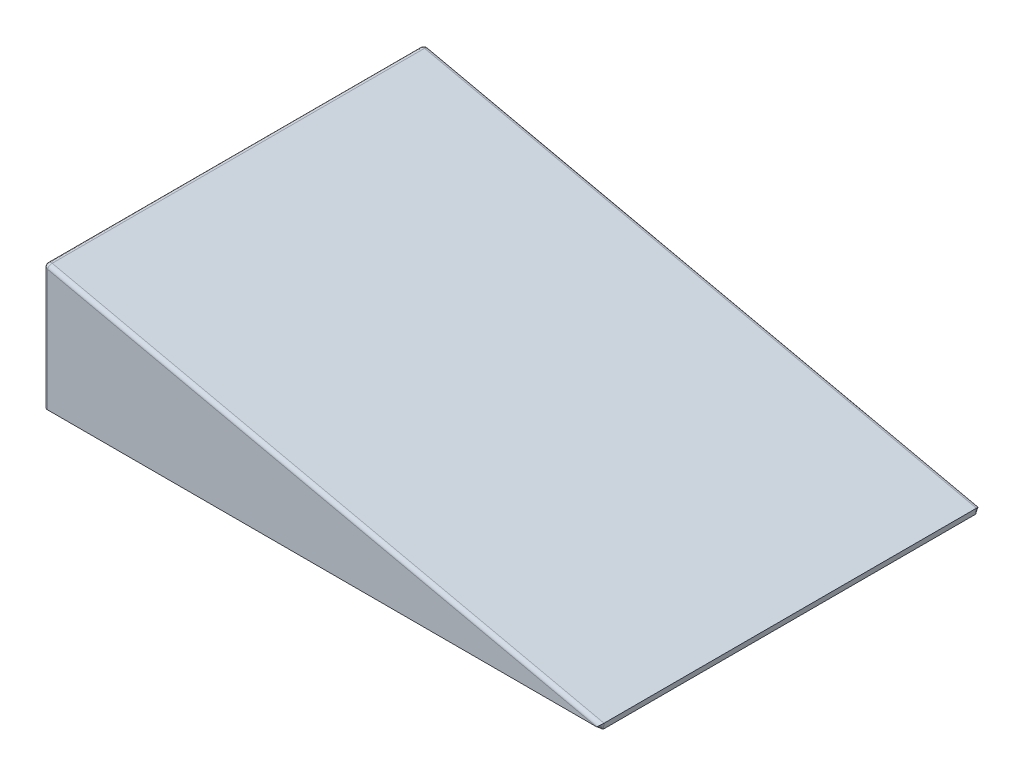
ISO-10303-21;
HEADER;
FILE_DESCRIPTION(('STEP AP214'),'2;1');
FILE_NAME('part.step','',(''),(''),'','','');
FILE_SCHEMA(('AUTOMOTIVE_DESIGN { 1 0 10303 214 1 1 1 1 }'));
ENDSEC;
DATA;
#1=APPLICATION_CONTEXT('core data for automotive mechanical design processes');
#2=APPLICATION_PROTOCOL_DEFINITION('international standard','automotive_design',2000,#1);
#3=PRODUCT_CONTEXT('',#1,'mechanical');
#4=PRODUCT('Part','Part','',(#3));
#5=PRODUCT_RELATED_PRODUCT_CATEGORY('part','',(#4));
#6=PRODUCT_DEFINITION_FORMATION('','',#4);
#7=PRODUCT_DEFINITION_CONTEXT('part definition',#1,'design');
#8=PRODUCT_DEFINITION('design','',#6,#7);
#9=PRODUCT_DEFINITION_SHAPE('','',#8);
#10=(LENGTH_UNIT() NAMED_UNIT(*) SI_UNIT(.MILLI.,.METRE.));
#11=(NAMED_UNIT(*) PLANE_ANGLE_UNIT() SI_UNIT($,.RADIAN.));
#12=(NAMED_UNIT(*) SI_UNIT($,.STERADIAN.) SOLID_ANGLE_UNIT());
#13=UNCERTAINTY_MEASURE_WITH_UNIT(LENGTH_MEASURE(1.E-05),#10,'distance_accuracy_value','');
#14=(GEOMETRIC_REPRESENTATION_CONTEXT(3) GLOBAL_UNCERTAINTY_ASSIGNED_CONTEXT((#13)) GLOBAL_UNIT_ASSIGNED_CONTEXT((#10,
#11,#12)) REPRESENTATION_CONTEXT('',''));
#15=CARTESIAN_POINT('',(0.,0.,0.));
#16=DIRECTION('',(0.,0.,1.));
#17=DIRECTION('',(1.,0.,0.));
#18=AXIS2_PLACEMENT_3D('',#15,#16,#17);
#19=CARTESIAN_POINT('',(0.,0.,500.));
#20=DIRECTION('',(-1.,0.,0.));
#21=DIRECTION('',(0.,0.,1.));
#22=AXIS2_PLACEMENT_3D('',#19,#20,#21);
#23=PLANE('',#22);
#24=DIRECTION('',(0.,1.,0.));
#25=VECTOR('',#24,1.);
#26=CARTESIAN_POINT('',(0.,0.,-490.));
#27=LINE('',#26,#25);
#28=CARTESIAN_POINT('',(0.,326.865758230426,-490.));
#29=VERTEX_POINT('',#28);
#30=CARTESIAN_POINT('',(0.,6.37070260807602,-490.));
#31=VERTEX_POINT('',#30);
#32=EDGE_CURVE('E149',#29,#31,#27,.F.);
#33=ORIENTED_EDGE('',*,*,#32,.T.);
#34=DIRECTION('',(0.,0.,1.));
#35=VECTOR('',#34,1.);
#36=CARTESIAN_POINT('',(0.,6.37070260807602,500.));
#37=LINE('',#36,#35);
#38=CARTESIAN_POINT('',(0.,6.37070260807602,490.));
#39=VERTEX_POINT('',#38);
#40=EDGE_CURVE('E489',#31,#39,#37,.T.);
#41=ORIENTED_EDGE('',*,*,#40,.T.);
#42=DIRECTION('',(0.,1.,0.));
#43=VECTOR('',#42,1.);
#44=CARTESIAN_POINT('',(0.,0.,490.));
#45=LINE('',#44,#43);
#46=CARTESIAN_POINT('',(0.,326.865758230426,490.));
#47=VERTEX_POINT('',#46);
#48=EDGE_CURVE('E186',#39,#47,#45,.T.);
#49=ORIENTED_EDGE('',*,*,#48,.T.);
#50=DIRECTION('',(0.,0.,-1.));
#51=VECTOR('',#50,1.);
#52=CARTESIAN_POINT('',(0.,326.865758230426,500.));
#53=LINE('',#52,#51);
#54=EDGE_CURVE('E141',#47,#29,#53,.T.);
#55=ORIENTED_EDGE('',*,*,#54,.T.);
#56=EDGE_LOOP('',(#33,#41,#49,#55));
#57=FACE_BOUND('',#56,.T.);
#58=ADVANCED_FACE('F45',(#57),#23,.T.);
#59=CARTESIAN_POINT('',(1530.59841835943,0.,500.));
#60=DIRECTION('',(0.,-1.,0.));
#61=DIRECTION('',(0.,0.,-1.));
#62=AXIS2_PLACEMENT_3D('',#59,#60,#61);
#63=PLANE('',#62);
#64=CARTESIAN_POINT('',(1463.12565350232,0.,-490.));
#65=CARTESIAN_POINT('',(1463.12565350228,0.,-490.105762412387));
#66=CARTESIAN_POINT('',(1463.07752777564,0.,-490.211519819488));
#67=CARTESIAN_POINT('',(1462.88686961966,0.,-490.418977898737));
#68=CARTESIAN_POINT('',(1462.74434188805,0.,-490.52067226064));
#69=CARTESIAN_POINT('',(1462.3703524546,0.,-490.716093502087));
#70=CARTESIAN_POINT('',(1462.13889998266,0.,-490.809815560233));
#71=CARTESIAN_POINT('',(1461.59595147585,0.,-490.985690032319));
#72=CARTESIAN_POINT('',(1461.284468852,0.,-491.067838102488));
#73=CARTESIAN_POINT('',(1460.59342647906,0.,-491.2174070469));
#74=CARTESIAN_POINT('',(1460.21388380538,0.,-491.284824225489));
#75=CARTESIAN_POINT('',(1459.40130393753,0.,-491.402339791223));
#76=CARTESIAN_POINT('',(1458.96828682569,0.,-491.452435274121));
#77=CARTESIAN_POINT('',(1458.06539645203,0.,-491.533381403733));
#78=CARTESIAN_POINT('',(1457.59554550647,0.,-491.564230049746));
#79=CARTESIAN_POINT('',(1456.63704219789,0.,-491.605496028784));
#80=CARTESIAN_POINT('',(1456.14841907014,0.,-491.615912341806));
#81=CARTESIAN_POINT('',(1455.65977277742,0.,-491.615912341806));
#82=B_SPLINE_CURVE_WITH_KNOTS('',3,(#64,#65,#66,#67,#68,#69,#70,#71,#72,#73,#74,#75,#76,#77,#78,
#79,#80,#81),.UNSPECIFIED.,.F.,.F.,(4,2,2,2,2,2,2,2,4),(1.5707963267949,1.76714586764426,
1.96349540849362,2.15984494934298,2.35619449019234,2.55254403104171,2.74889357189107,
2.94524311274043,3.14159265358979),.UNSPECIFIED.);
#83=CARTESIAN_POINT('',(1455.65977277742,0.,-491.615912341806));
#84=VERTEX_POINT('',#83);
#85=CARTESIAN_POINT('',(1463.12565350232,0.,-490.));
#86=VERTEX_POINT('',#85);
#87=EDGE_CURVE('E271',#84,#86,#82,.F.);
#88=ORIENTED_EDGE('',*,*,#87,.T.);
#89=DIRECTION('',(0.,0.,1.));
#90=VECTOR('',#89,1.);
#91=CARTESIAN_POINT('',(1463.12565350232,0.,500.));
#92=LINE('',#91,#90);
#93=CARTESIAN_POINT('',(1463.12565350232,0.,490.));
#94=VERTEX_POINT('',#93);
#95=EDGE_CURVE('E11',#86,#94,#92,.T.);
#96=ORIENTED_EDGE('',*,*,#95,.T.);
#97=CARTESIAN_POINT('',(1455.65977277742,0.,491.615912341806));
#98=CARTESIAN_POINT('',(1456.14841907014,0.,491.615912341806));
#99=CARTESIAN_POINT('',(1456.63704219789,0.,491.605496028784));
#100=CARTESIAN_POINT('',(1457.59554550647,0.,491.564230049746));
#101=CARTESIAN_POINT('',(1458.06539645203,0.,491.533381403733));
#102=CARTESIAN_POINT('',(1458.96828682569,0.,491.452435274121));
#103=CARTESIAN_POINT('',(1459.40130393753,0.,491.402339791223));
#104=CARTESIAN_POINT('',(1460.21388380538,0.,491.284824225489));
#105=CARTESIAN_POINT('',(1460.59342647906,0.,491.2174070469));
#106=CARTESIAN_POINT('',(1461.284468852,0.,491.067838102488));
#107=CARTESIAN_POINT('',(1461.59595147585,0.,490.985690032319));
#108=CARTESIAN_POINT('',(1462.13889998266,0.,490.809815560233));
#109=CARTESIAN_POINT('',(1462.3703524546,0.,490.716093502087));
#110=CARTESIAN_POINT('',(1462.74434188805,0.,490.52067226064));
#111=CARTESIAN_POINT('',(1462.88686961966,0.,490.418977898737));
#112=CARTESIAN_POINT('',(1463.07752777564,0.,490.211519819488));
#113=CARTESIAN_POINT('',(1463.12565350228,0.,490.105762412387));
#114=CARTESIAN_POINT('',(1463.12565350232,0.,490.));
#115=B_SPLINE_CURVE_WITH_KNOTS('',3,(#97,#98,#99,#100,#101,#102,#103,#104,#105,#106,#107,#108,
#109,#110,#111,#112,#113,#114),.UNSPECIFIED.,.F.,.F.,(4,2,2,2,2,2,2,2,4),(0.,0.196349540849362,
0.392699081698724,0.589048622548086,0.785398163397448,0.98174770424681,1.17809724509617,
1.37444678594553,1.5707963267949),.UNSPECIFIED.);
#116=CARTESIAN_POINT('',(1455.65977277742,0.,491.615912341806));
#117=VERTEX_POINT('',#116);
#118=EDGE_CURVE('E58',#94,#117,#115,.F.);
#119=ORIENTED_EDGE('',*,*,#118,.T.);
#120=DIRECTION('',(-1.,0.,0.));
#121=VECTOR('',#120,1.);
#122=CARTESIAN_POINT('',(1530.59841835943,0.,491.615912341806));
#123=LINE('',#122,#121);
#124=CARTESIAN_POINT('',(10.,0.,491.615912341806));
#125=VERTEX_POINT('',#124);
#126=EDGE_CURVE('E307',#117,#125,#123,.T.);
#127=ORIENTED_EDGE('',*,*,#126,.T.);
#128=CARTESIAN_POINT('',(10.,0.,490.));
#129=DIRECTION('',(0.,-1.,0.));
#130=DIRECTION('',(0.,0.,-1.));
#131=AXIS2_PLACEMENT_3D('',#128,#129,#130);
#132=CIRCLE('',#131,1.61591234180582);
#133=CARTESIAN_POINT('',(8.38408765819418,0.,490.));
#134=VERTEX_POINT('',#133);
#135=EDGE_CURVE('E315',#125,#134,#132,.T.);
#136=ORIENTED_EDGE('',*,*,#135,.T.);
#137=DIRECTION('',(0.,0.,-1.));
#138=VECTOR('',#137,1.);
#139=CARTESIAN_POINT('',(8.38408765819421,0.,500.));
#140=LINE('',#139,#138);
#141=CARTESIAN_POINT('',(8.38408765819418,0.,-490.));
#142=VERTEX_POINT('',#141);
#143=EDGE_CURVE('E501',#134,#142,#140,.T.);
#144=ORIENTED_EDGE('',*,*,#143,.T.);
#145=CARTESIAN_POINT('',(10.,0.,-490.));
#146=DIRECTION('',(0.,-1.,0.));
#147=DIRECTION('',(0.,0.,-1.));
#148=AXIS2_PLACEMENT_3D('',#145,#146,#147);
#149=CIRCLE('',#148,1.6159123418058);
#150=CARTESIAN_POINT('',(10.,0.,-491.615912341806));
#151=VERTEX_POINT('',#150);
#152=EDGE_CURVE('E499',#142,#151,#149,.T.);
#153=ORIENTED_EDGE('',*,*,#152,.T.);
#154=DIRECTION('',(1.,0.,0.));
#155=VECTOR('',#154,1.);
#156=CARTESIAN_POINT('',(1455.65977277742,0.,-491.615912341806));
#157=LINE('',#156,#155);
#158=EDGE_CURVE('E275',#151,#84,#157,.T.);
#159=ORIENTED_EDGE('',*,*,#158,.T.);
#160=EDGE_LOOP('',(#88,#96,#119,#127,#136,#144,#153,#159));
#161=FACE_BOUND('',#160,.T.);
#162=ADVANCED_FACE('F289',(#161),#63,.T.);
#163=CARTESIAN_POINT('',(0.,339.3255,500.));
#164=DIRECTION('',(0.216439613938096,0.976296007119935,0.));
#165=DIRECTION('',(-0.976296007119935,0.216439613938096,0.));
#166=AXIS2_PLACEMENT_3D('',#163,#164,#165);
#167=PLANE('',#166);
#168=DIRECTION('',(0.976296007119935,-0.216439613938096,0.));
#169=VECTOR('',#168,1.);
#170=CARTESIAN_POINT('',(0.,339.3255,490.));
#171=LINE('',#170,#169);
#172=CARTESIAN_POINT('',(12.164396139381,336.628718301625,490.));
#173=VERTEX_POINT('',#172);
#174=CARTESIAN_POINT('',(1464.94030219829,14.5560539121146,490.));
#175=VERTEX_POINT('',#174);
#176=EDGE_CURVE('E208',#173,#175,#171,.T.);
#177=ORIENTED_EDGE('',*,*,#176,.T.);
#178=DIRECTION('',(0.,0.,-1.));
#179=VECTOR('',#178,1.);
#180=CARTESIAN_POINT('',(1464.94030219829,14.5560539121146,500.));
#181=LINE('',#180,#179);
#182=CARTESIAN_POINT('',(1464.94030219829,14.5560539121145,-490.));
#183=VERTEX_POINT('',#182);
#184=EDGE_CURVE('E250',#175,#183,#181,.T.);
#185=ORIENTED_EDGE('',*,*,#184,.T.);
#186=DIRECTION('',(0.976296007119935,-0.216439613938096,0.));
#187=VECTOR('',#186,1.);
#188=CARTESIAN_POINT('',(0.,339.3255,-490.));
#189=LINE('',#188,#187);
#190=CARTESIAN_POINT('',(12.164396139381,336.628718301625,-490.));
#191=VERTEX_POINT('',#190);
#192=EDGE_CURVE('E180',#183,#191,#189,.F.);
#193=ORIENTED_EDGE('',*,*,#192,.T.);
#194=DIRECTION('',(0.,0.,-1.));
#195=VECTOR('',#194,1.);
#196=CARTESIAN_POINT('',(12.164396139381,336.628718301625,500.));
#197=LINE('',#196,#195);
#198=EDGE_CURVE('E212',#191,#173,#197,.F.);
#199=ORIENTED_EDGE('',*,*,#198,.T.);
#200=EDGE_LOOP('',(#177,#185,#193,#199));
#201=FACE_BOUND('',#200,.T.);
#202=ADVANCED_FACE('F248',(#201),#167,.T.);
#203=CARTESIAN_POINT('',(0.,0.,500.));
#204=DIRECTION('',(0.,0.,1.));
#205=DIRECTION('',(1.,0.,0.));
#206=AXIS2_PLACEMENT_3D('',#203,#204,#205);
#207=PLANE('',#206);
#208=DIRECTION('',(0.,1.,0.));
#209=VECTOR('',#208,1.);
#210=CARTESIAN_POINT('',(10.,0.,500.));
#211=LINE('',#210,#209);
#212=CARTESIAN_POINT('',(10.,326.865758230426,500.));
#213=VERTEX_POINT('',#212);
#214=CARTESIAN_POINT('',(10.,6.37070260807602,500.));
#215=VERTEX_POINT('',#214);
#216=EDGE_CURVE('E194',#213,#215,#211,.F.);
#217=ORIENTED_EDGE('',*,*,#216,.T.);
#218=DIRECTION('',(1.,0.,0.));
#219=VECTOR('',#218,1.);
#220=CARTESIAN_POINT('',(0.,6.37070260807602,500.));
#221=LINE('',#220,#219);
#222=CARTESIAN_POINT('',(1455.65977277742,6.37070260807582,500.));
#223=VERTEX_POINT('',#222);
#224=EDGE_CURVE('E202',#215,#223,#221,.T.);
#225=ORIENTED_EDGE('',*,*,#224,.T.);
#226=DIRECTION('',(0.976296007119935,-0.216439613938096,0.));
#227=VECTOR('',#226,1.);
#228=CARTESIAN_POINT('',(69.5381803477638,313.666461423854,500.));
#229=LINE('',#228,#227);
#230=EDGE_CURVE('E191',#223,#213,#229,.F.);
#231=ORIENTED_EDGE('',*,*,#230,.T.);
#232=EDGE_LOOP('',(#217,#225,#231));
#233=FACE_BOUND('',#232,.T.);
#234=ADVANCED_FACE('F510',(#233),#207,.T.);
#235=CARTESIAN_POINT('',(0.,0.,-500.));
#236=DIRECTION('',(0.,0.,1.));
#237=DIRECTION('',(1.,0.,0.));
#238=AXIS2_PLACEMENT_3D('',#235,#236,#237);
#239=PLANE('',#238);
#240=DIRECTION('',(0.976296007119935,-0.216439613938096,0.));
#241=VECTOR('',#240,1.);
#242=CARTESIAN_POINT('',(1528.43402222005,-9.76296007119931,-500.));
#243=LINE('',#242,#241);
#244=CARTESIAN_POINT('',(10.,326.865758230426,-500.));
#245=VERTEX_POINT('',#244);
#246=CARTESIAN_POINT('',(1455.65977277742,6.37070260807602,-500.));
#247=VERTEX_POINT('',#246);
#248=EDGE_CURVE('E135',#245,#247,#243,.T.);
#249=ORIENTED_EDGE('',*,*,#248,.T.);
#250=DIRECTION('',(-1.,0.,0.));
#251=VECTOR('',#250,1.);
#252=CARTESIAN_POINT('',(1455.65977277742,6.37070260807602,-500.));
#253=LINE('',#252,#251);
#254=CARTESIAN_POINT('',(10.,6.37070260807598,-500.));
#255=VERTEX_POINT('',#254);
#256=EDGE_CURVE('E137',#247,#255,#253,.T.);
#257=ORIENTED_EDGE('',*,*,#256,.T.);
#258=DIRECTION('',(0.,1.,0.));
#259=VECTOR('',#258,1.);
#260=CARTESIAN_POINT('',(10.,339.3255,-500.));
#261=LINE('',#260,#259);
#262=EDGE_CURVE('E131',#255,#245,#261,.T.);
#263=ORIENTED_EDGE('',*,*,#262,.T.);
#264=EDGE_LOOP('',(#249,#257,#263));
#265=FACE_BOUND('',#264,.T.);
#266=ADVANCED_FACE('F133',(#265),#239,.F.);
#267=CARTESIAN_POINT('',(-2.16439613938096,329.562539928801,490.));
#268=DIRECTION('',(0.976296007119935,-0.216439613938096,0.));
#269=DIRECTION('',(0.216439613938096,0.976296007119935,0.));
#270=AXIS2_PLACEMENT_3D('',#267,#268,#269);
#271=CYLINDRICAL_SURFACE('',#270,10.);
#272=ORIENTED_EDGE('',*,*,#230,.F.);
#273=CARTESIAN_POINT('',(1464.94030219829,14.5560539121144,490.));
#274=CARTESIAN_POINT('',(1464.94030219803,14.5560539121722,490.654505876652));
#275=CARTESIAN_POINT('',(1464.88047908577,14.5032904145342,491.308980778325));
#276=CARTESIAN_POINT('',(1464.64347976975,14.2942589494784,492.592825661997));
#277=CARTESIAN_POINT('',(1464.46630940556,14.1379961324281,493.222156593325));
#278=CARTESIAN_POINT('',(1464.0014185149,13.7279661561555,494.431512053976));
#279=CARTESIAN_POINT('',(1463.71370946161,13.4742091162238,495.011506746259));
#280=CARTESIAN_POINT('',(1463.0387924923,12.8789378505863,496.099897914133));
#281=CARTESIAN_POINT('',(1462.65160124721,12.5374383282335,496.608267508455));
#282=CARTESIAN_POINT('',(1461.79259488062,11.7798017148784,497.533868115276));
#283=CARTESIAN_POINT('',(1461.32080098529,11.3636833447164,497.951076257332));
#284=CARTESIAN_POINT('',(1460.31071635535,10.4727969340995,498.678315988718));
#285=CARTESIAN_POINT('',(1459.77245058428,9.99805091124137,498.988329605197));
#286=CARTESIAN_POINT('',(1458.65010467645,9.00815096919795,499.489261045029));
#287=CARTESIAN_POINT('',(1458.06605228109,8.49302151669082,499.680166487252));
#288=CARTESIAN_POINT('',(1456.87457622015,7.44214934290101,499.935539120813));
#289=CARTESIAN_POINT('',(1456.2671888967,6.90643867410367,500.));
#290=CARTESIAN_POINT('',(1455.65977277742,6.37070260807575,500.));
#291=B_SPLINE_CURVE_WITH_KNOTS('',3,(#273,#274,#275,#276,#277,#278,#279,#280,#281,#282,#283,
#284,#285,#286,#287,#288,#289,#290),.UNSPECIFIED.,.F.,.F.,(4,2,2,2,2,2,2,2,4),(0.,
0.196349540849362,0.392699081698724,0.589048622548086,0.785398163397448,0.98174770424681,
1.17809724509617,1.37444678594553,1.5707963267949),.UNSPECIFIED.);
#292=EDGE_CURVE('E205',#223,#175,#291,.F.);
#293=ORIENTED_EDGE('',*,*,#292,.T.);
#294=ORIENTED_EDGE('',*,*,#176,.F.);
#295=CARTESIAN_POINT('',(10.,326.865758230426,490.));
#296=DIRECTION('',(-0.976296007119935,0.216439613938097,0.));
#297=DIRECTION('',(-0.216439613938097,-0.976296007119935,0.));
#298=AXIS2_PLACEMENT_3D('',#295,#296,#297);
#299=CIRCLE('',#298,10.);
#300=EDGE_CURVE('E171',#213,#173,#299,.T.);
#301=ORIENTED_EDGE('',*,*,#300,.F.);
#302=EDGE_LOOP('',(#272,#293,#294,#301));
#303=FACE_BOUND('',#302,.T.);
#304=ADVANCED_FACE('F243',(#303),#271,.T.);
#305=CARTESIAN_POINT('',(10.,0.,490.));
#306=DIRECTION('',(0.,1.,0.));
#307=DIRECTION('',(0.,0.,1.));
#308=AXIS2_PLACEMENT_3D('',#305,#306,#307);
#309=CYLINDRICAL_SURFACE('',#308,10.);
#310=ORIENTED_EDGE('',*,*,#48,.F.);
#311=CARTESIAN_POINT('',(10.,6.37070260807602,490.));
#312=DIRECTION('',(0.,-1.,0.));
#313=DIRECTION('',(0.,0.,-1.));
#314=AXIS2_PLACEMENT_3D('',#311,#312,#313);
#315=CIRCLE('',#314,10.);
#316=EDGE_CURVE('E200',#39,#215,#315,.F.);
#317=ORIENTED_EDGE('',*,*,#316,.T.);
#318=ORIENTED_EDGE('',*,*,#216,.F.);
#319=CARTESIAN_POINT('',(10.,326.865758230426,490.));
#320=DIRECTION('',(0.,1.,0.));
#321=DIRECTION('',(0.,0.,1.));
#322=AXIS2_PLACEMENT_3D('',#319,#320,#321);
#323=CIRCLE('',#322,10.);
#324=EDGE_CURVE('E175',#47,#213,#323,.T.);
#325=ORIENTED_EDGE('',*,*,#324,.F.);
#326=EDGE_LOOP('',(#310,#317,#318,#325));
#327=FACE_BOUND('',#326,.T.);
#328=ADVANCED_FACE('F234',(#327),#309,.T.);
#329=CARTESIAN_POINT('',(10.,326.865758230426,490.));
#330=DIRECTION('',(0.,0.,1.));
#331=DIRECTION('',(1.,0.,0.));
#332=AXIS2_PLACEMENT_3D('',#329,#330,#331);
#333=SPHERICAL_SURFACE('',#332,10.);
#334=ORIENTED_EDGE('',*,*,#324,.T.);
#335=ORIENTED_EDGE('',*,*,#300,.T.);
#336=CARTESIAN_POINT('',(10.,326.865758230426,490.));
#337=DIRECTION('',(0.,0.,1.));
#338=DIRECTION('',(1.,0.,0.));
#339=AXIS2_PLACEMENT_3D('',#336,#337,#338);
#340=CIRCLE('',#339,10.);
#341=EDGE_CURVE('E163',#47,#173,#340,.F.);
#342=ORIENTED_EDGE('',*,*,#341,.F.);
#343=EDGE_LOOP('',(#334,#335,#342));
#344=FACE_BOUND('',#343,.T.);
#345=ADVANCED_FACE('F228',(#344),#333,.T.);
#346=CARTESIAN_POINT('',(69.5381803477638,313.666461423854,-490.));
#347=DIRECTION('',(-0.976296007119935,0.216439613938096,0.));
#348=DIRECTION('',(-0.216439613938096,-0.976296007119935,0.));
#349=AXIS2_PLACEMENT_3D('',#346,#347,#348);
#350=CYLINDRICAL_SURFACE('',#349,10.);
#351=ORIENTED_EDGE('',*,*,#192,.F.);
#352=CARTESIAN_POINT('',(1455.65977277742,6.37070260807604,-500.));
#353=CARTESIAN_POINT('',(1456.26718889606,6.90643867482933,-500.));
#354=CARTESIAN_POINT('',(1456.87457622015,7.4421493429006,-499.935539120813));
#355=CARTESIAN_POINT('',(1458.06605228109,8.49302151669124,-499.680166487252));
#356=CARTESIAN_POINT('',(1458.6501046767,9.00815096913477,-499.489261045031));
#357=CARTESIAN_POINT('',(1459.77245058402,9.99805091130405,-498.988329605194));
#358=CARTESIAN_POINT('',(1460.31071635535,10.4727969341,-498.678315988718));
#359=CARTESIAN_POINT('',(1461.32080098528,11.3636833447158,-497.951076257333));
#360=CARTESIAN_POINT('',(1461.79259488082,11.779801714856,-497.533868115255));
#361=CARTESIAN_POINT('',(1462.65160124701,12.5374383282555,-496.608267508476));
#362=CARTESIAN_POINT('',(1463.03879249229,12.8789378505863,-496.099897914133));
#363=CARTESIAN_POINT('',(1463.71370946161,13.474209116224,-495.011506746259));
#364=CARTESIAN_POINT('',(1464.00141851502,13.7279661561343,-494.431512053965));
#365=CARTESIAN_POINT('',(1464.46630940544,14.1379961324492,-493.222156593337));
#366=CARTESIAN_POINT('',(1464.64347976976,14.2942589494754,-492.592825661997));
#367=CARTESIAN_POINT('',(1464.88047908575,14.5032904145377,-491.308980778325));
#368=CARTESIAN_POINT('',(1464.94030219826,14.5560539121204,-490.654505876651));
#369=CARTESIAN_POINT('',(1464.94030219829,14.5560539121146,-490.));
#370=B_SPLINE_CURVE_WITH_KNOTS('',3,(#352,#353,#354,#355,#356,#357,#358,#359,#360,#361,#362,
#363,#364,#365,#366,#367,#368,#369),.UNSPECIFIED.,.F.,.F.,(4,2,2,2,2,2,2,2,4),(1.5707963267949,
1.76714586764426,1.96349540849362,2.15984494934298,2.35619449019234,2.55254403104171,
2.74889357189107,2.94524311274043,3.14159265358979),.UNSPECIFIED.);
#371=EDGE_CURVE('E168',#183,#247,#370,.F.);
#372=ORIENTED_EDGE('',*,*,#371,.T.);
#373=ORIENTED_EDGE('',*,*,#248,.F.);
#374=CARTESIAN_POINT('',(10.,326.865758230426,-490.));
#375=DIRECTION('',(-0.976296007119935,0.216439613938096,0.));
#376=DIRECTION('',(-0.216439613938096,-0.976296007119935,0.));
#377=AXIS2_PLACEMENT_3D('',#374,#375,#376);
#378=CIRCLE('',#377,10.);
#379=EDGE_CURVE('E157',#191,#245,#378,.T.);
#380=ORIENTED_EDGE('',*,*,#379,.F.);
#381=EDGE_LOOP('',(#351,#372,#373,#380));
#382=FACE_BOUND('',#381,.T.);
#383=ADVANCED_FACE('F166',(#382),#350,.T.);
#384=CARTESIAN_POINT('',(10.,326.865758230426,500.));
#385=DIRECTION('',(0.,0.,-1.));
#386=DIRECTION('',(-1.,0.,0.));
#387=AXIS2_PLACEMENT_3D('',#384,#385,#386);
#388=CYLINDRICAL_SURFACE('',#387,10.);
#389=ORIENTED_EDGE('',*,*,#341,.T.);
#390=ORIENTED_EDGE('',*,*,#198,.F.);
#391=CARTESIAN_POINT('',(10.,326.865758230426,-490.));
#392=DIRECTION('',(0.,0.,-1.));
#393=DIRECTION('',(-1.,0.,0.));
#394=AXIS2_PLACEMENT_3D('',#391,#392,#393);
#395=CIRCLE('',#394,10.);
#396=EDGE_CURVE('E153',#29,#191,#395,.T.);
#397=ORIENTED_EDGE('',*,*,#396,.F.);
#398=ORIENTED_EDGE('',*,*,#54,.F.);
#399=EDGE_LOOP('',(#389,#390,#397,#398));
#400=FACE_BOUND('',#399,.T.);
#401=ADVANCED_FACE('F466',(#400),#388,.T.);
#402=CARTESIAN_POINT('',(10.,326.865758230426,-490.));
#403=DIRECTION('',(0.,0.,-1.));
#404=DIRECTION('',(-1.,0.,0.));
#405=AXIS2_PLACEMENT_3D('',#402,#403,#404);
#406=SPHERICAL_SURFACE('',#405,10.);
#407=ORIENTED_EDGE('',*,*,#396,.T.);
#408=ORIENTED_EDGE('',*,*,#379,.T.);
#409=CARTESIAN_POINT('',(10.,326.865758230426,-490.));
#410=DIRECTION('',(0.,1.,0.));
#411=DIRECTION('',(-1.,0.,0.));
#412=AXIS2_PLACEMENT_3D('',#409,#410,#411);
#413=CIRCLE('',#412,10.);
#414=EDGE_CURVE('E145',#29,#245,#413,.F.);
#415=ORIENTED_EDGE('',*,*,#414,.F.);
#416=EDGE_LOOP('',(#407,#408,#415));
#417=FACE_BOUND('',#416,.T.);
#418=ADVANCED_FACE('F158',(#417),#406,.T.);
#419=CARTESIAN_POINT('',(10.,0.,-490.));
#420=DIRECTION('',(0.,-1.,0.));
#421=DIRECTION('',(0.,0.,-1.));
#422=AXIS2_PLACEMENT_3D('',#419,#420,#421);
#423=CYLINDRICAL_SURFACE('',#422,10.);
#424=ORIENTED_EDGE('',*,*,#262,.F.);
#425=CARTESIAN_POINT('',(10.,6.37070260807602,-490.));
#426=DIRECTION('',(0.,-1.,0.));
#427=DIRECTION('',(0.,0.,-1.));
#428=AXIS2_PLACEMENT_3D('',#425,#426,#427);
#429=CIRCLE('',#428,10.);
#430=EDGE_CURVE('E485',#255,#31,#429,.F.);
#431=ORIENTED_EDGE('',*,*,#430,.T.);
#432=ORIENTED_EDGE('',*,*,#32,.F.);
#433=ORIENTED_EDGE('',*,*,#414,.T.);
#434=EDGE_LOOP('',(#424,#431,#432,#433));
#435=FACE_BOUND('',#434,.T.);
#436=ADVANCED_FACE('F147',(#435),#423,.T.);
#437=CARTESIAN_POINT('',(10.,6.37070260807602,490.));
#438=DIRECTION('',(0.,1.,0.));
#439=DIRECTION('',(0.,0.,1.));
#440=AXIS2_PLACEMENT_3D('',#437,#438,#439);
#441=CONICAL_SURFACE('',#440,10.,0.921016912343269);
#442=DIRECTION('',(-0.796217274555234,0.605010786432635,0.));
#443=VECTOR('',#442,1.);
#444=CARTESIAN_POINT('',(0.,6.37070260807602,490.));
#445=LINE('',#444,#443);
#446=EDGE_CURVE('E327',#134,#39,#445,.T.);
#447=ORIENTED_EDGE('',*,*,#446,.F.);
#448=ORIENTED_EDGE('',*,*,#135,.F.);
#449=DIRECTION('',(0.,0.605010786432635,0.796217274555234));
#450=VECTOR('',#449,1.);
#451=CARTESIAN_POINT('',(10.,6.37070260807602,500.));
#452=LINE('',#451,#450);
#453=EDGE_CURVE('E154',#215,#125,#452,.F.);
#454=ORIENTED_EDGE('',*,*,#453,.F.);
#455=ORIENTED_EDGE('',*,*,#316,.F.);
#456=EDGE_LOOP('',(#447,#448,#454,#455));
#457=FACE_BOUND('',#456,.T.);
#458=ADVANCED_FACE('F48',(#457),#441,.T.);
#459=CARTESIAN_POINT('',(0.,6.37070260807602,500.));
#460=DIRECTION('',(0.,0.796217274555233,-0.605010786432636));
#461=DIRECTION('',(1.,0.,0.));
#462=AXIS2_PLACEMENT_3D('',#459,#460,#461);
#463=PLANE('',#462);
#464=ORIENTED_EDGE('',*,*,#453,.T.);
#465=ORIENTED_EDGE('',*,*,#126,.F.);
#466=CARTESIAN_POINT('',(1455.65977277742,6.37070260807575,500.));
#467=CARTESIAN_POINT('',(1455.65977277742,0.,491.615912341806));
#468=B_SPLINE_CURVE_WITH_KNOTS('',1,(#466,#467),.UNSPECIFIED.,.F.,.F.,(2,2),(0.,1.),.UNSPECIFIED.);
#469=EDGE_CURVE('E326',#223,#117,#468,.T.);
#470=ORIENTED_EDGE('',*,*,#469,.F.);
#471=ORIENTED_EDGE('',*,*,#224,.F.);
#472=EDGE_LOOP('',(#464,#465,#470,#471));
#473=FACE_BOUND('',#472,.T.);
#474=ADVANCED_FACE('F436',(#473),#463,.F.);
#475=CARTESIAN_POINT('',(0.,6.37070260807602,500.));
#476=DIRECTION('',(0.605010786432633,0.796217274555235,0.));
#477=DIRECTION('',(0.,0.,1.));
#478=AXIS2_PLACEMENT_3D('',#475,#476,#477);
#479=PLANE('',#478);
#480=ORIENTED_EDGE('',*,*,#446,.T.);
#481=ORIENTED_EDGE('',*,*,#40,.F.);
#482=DIRECTION('',(0.796217274555235,-0.605010786432633,0.));
#483=VECTOR('',#482,1.);
#484=CARTESIAN_POINT('',(0.,6.37070260807602,-490.));
#485=LINE('',#484,#483);
#486=EDGE_CURVE('E262',#142,#31,#485,.F.);
#487=ORIENTED_EDGE('',*,*,#486,.F.);
#488=ORIENTED_EDGE('',*,*,#143,.F.);
#489=EDGE_LOOP('',(#480,#481,#487,#488));
#490=FACE_BOUND('',#489,.T.);
#491=ADVANCED_FACE('F448',(#490),#479,.F.);
#492=CARTESIAN_POINT('',(1463.12565350232,0.,490.));
#493=CARTESIAN_POINT('',(1463.12565350228,0.,490.105762412387));
#494=CARTESIAN_POINT('',(1463.07752777564,0.,490.211519819488));
#495=CARTESIAN_POINT('',(1462.88686961966,0.,490.418977898737));
#496=CARTESIAN_POINT('',(1462.74434188805,0.,490.52067226064));
#497=CARTESIAN_POINT('',(1462.3703524546,0.,490.716093502087));
#498=CARTESIAN_POINT('',(1462.13889998266,0.,490.809815560233));
#499=CARTESIAN_POINT('',(1461.59595147585,0.,490.985690032319));
#500=CARTESIAN_POINT('',(1461.284468852,0.,491.067838102488));
#501=CARTESIAN_POINT('',(1460.59342647906,0.,491.2174070469));
#502=CARTESIAN_POINT('',(1460.21388380538,0.,491.284824225489));
#503=CARTESIAN_POINT('',(1459.40130393753,0.,491.402339791223));
#504=CARTESIAN_POINT('',(1458.96828682569,0.,491.452435274121));
#505=CARTESIAN_POINT('',(1458.06539645203,0.,491.533381403733));
#506=CARTESIAN_POINT('',(1457.59554550647,0.,491.564230049746));
#507=CARTESIAN_POINT('',(1456.63704219789,0.,491.605496028784));
#508=CARTESIAN_POINT('',(1456.14841907014,0.,491.615912341806));
#509=CARTESIAN_POINT('',(1455.65977277742,0.,491.615912341806));
#510=CARTESIAN_POINT('',(1464.94030219829,14.5560539121144,490.));
#511=CARTESIAN_POINT('',(1464.94030219803,14.5560539121722,490.654505876652));
#512=CARTESIAN_POINT('',(1464.88047908577,14.5032904145342,491.308980778325));
#513=CARTESIAN_POINT('',(1464.64347976975,14.2942589494784,492.592825661997));
#514=CARTESIAN_POINT('',(1464.46630940556,14.1379961324281,493.222156593325));
#515=CARTESIAN_POINT('',(1464.0014185149,13.7279661561555,494.431512053976));
#516=CARTESIAN_POINT('',(1463.71370946161,13.4742091162238,495.011506746259));
#517=CARTESIAN_POINT('',(1463.0387924923,12.8789378505863,496.099897914133));
#518=CARTESIAN_POINT('',(1462.65160124721,12.5374383282335,496.608267508455));
#519=CARTESIAN_POINT('',(1461.79259488062,11.7798017148784,497.533868115276));
#520=CARTESIAN_POINT('',(1461.32080098529,11.3636833447164,497.951076257332));
#521=CARTESIAN_POINT('',(1460.31071635535,10.4727969340995,498.678315988718));
#522=CARTESIAN_POINT('',(1459.77245058428,9.99805091124137,498.988329605197));
#523=CARTESIAN_POINT('',(1458.65010467645,9.00815096919795,499.489261045029));
#524=CARTESIAN_POINT('',(1458.06605228109,8.49302151669082,499.680166487252));
#525=CARTESIAN_POINT('',(1456.87457622015,7.44214934290101,499.935539120813));
#526=CARTESIAN_POINT('',(1456.2671888967,6.90643867410367,500.));
#527=CARTESIAN_POINT('',(1455.65977277742,6.37070260807575,500.));
#528=B_SPLINE_SURFACE_WITH_KNOTS('',1,3,((#492,#493,#494,#495,#496,#497,#498,#499,#500,#501,
#502,#503,#504,#505,#506,#507,#508,#509),(#510,#511,#512,#513,#514,#515,#516,#517,#518,#519,
#520,#521,#522,#523,#524,#525,#526,#527)),.UNSPECIFIED.,.F.,.F.,.F.,(2,2),(4,2,2,2,2,2,2,2,4),
(0.,1.),(0.,0.196349540849362,0.392699081698724,0.589048622548086,0.785398163397448,
0.98174770424681,1.17809724509617,1.37444678594553,1.5707963267949),.UNSPECIFIED.);
#529=CARTESIAN_POINT('',(1463.12565350232,0.,490.));
#530=CARTESIAN_POINT('',(1464.94030219829,14.5560539121144,490.));
#531=B_SPLINE_CURVE_WITH_KNOTS('',1,(#529,#530),.UNSPECIFIED.,.F.,.F.,(2,2),(0.,1.),.UNSPECIFIED.);
#532=EDGE_CURVE('E254',#175,#94,#531,.F.);
#533=ORIENTED_EDGE('',*,*,#469,.T.);
#534=ORIENTED_EDGE('',*,*,#118,.F.);
#535=ORIENTED_EDGE('',*,*,#532,.F.);
#536=ORIENTED_EDGE('',*,*,#292,.F.);
#537=EDGE_LOOP('',(#533,#534,#535,#536));
#538=FACE_BOUND('',#537,.T.);
#539=ADVANCED_FACE('F257',(#538),#528,.T.);
#540=CARTESIAN_POINT('',(10.,6.37070260807602,-490.));
#541=DIRECTION('',(0.,1.,0.));
#542=DIRECTION('',(0.,0.,1.));
#543=AXIS2_PLACEMENT_3D('',#540,#541,#542);
#544=CONICAL_SURFACE('',#543,10.,0.921016912343271);
#545=ORIENTED_EDGE('',*,*,#486,.T.);
#546=ORIENTED_EDGE('',*,*,#430,.F.);
#547=DIRECTION('',(0.,0.605010786432634,-0.796217274555235));
#548=VECTOR('',#547,1.);
#549=CARTESIAN_POINT('',(10.,6.37070260807602,-500.));
#550=LINE('',#549,#548);
#551=EDGE_CURVE('E263',#151,#255,#550,.T.);
#552=ORIENTED_EDGE('',*,*,#551,.F.);
#553=ORIENTED_EDGE('',*,*,#152,.F.);
#554=EDGE_LOOP('',(#545,#546,#552,#553));
#555=FACE_BOUND('',#554,.T.);
#556=ADVANCED_FACE('F449',(#555),#544,.T.);
#557=CARTESIAN_POINT('',(1464.94030219829,14.5560539121146,500.));
#558=DIRECTION('',(-0.992318584192088,0.123708639419442,0.));
#559=DIRECTION('',(0.,0.,-1.));
#560=AXIS2_PLACEMENT_3D('',#557,#558,#559);
#561=PLANE('',#560);
#562=ORIENTED_EDGE('',*,*,#532,.T.);
#563=ORIENTED_EDGE('',*,*,#95,.F.);
#564=CARTESIAN_POINT('',(1464.94030219829,14.5560539121146,-490.));
#565=CARTESIAN_POINT('',(1463.12565350232,0.,-490.));
#566=B_SPLINE_CURVE_WITH_KNOTS('',1,(#564,#565),.UNSPECIFIED.,.F.,.F.,(2,2),(0.,1.),.UNSPECIFIED.);
#567=EDGE_CURVE('E268',#183,#86,#566,.T.);
#568=ORIENTED_EDGE('',*,*,#567,.F.);
#569=ORIENTED_EDGE('',*,*,#184,.F.);
#570=EDGE_LOOP('',(#562,#563,#568,#569));
#571=FACE_BOUND('',#570,.T.);
#572=ADVANCED_FACE('F267',(#571),#561,.F.);
#573=CARTESIAN_POINT('',(0.,6.37070260807602,-500.));
#574=DIRECTION('',(0.,-0.796217274555235,-0.605010786432633));
#575=DIRECTION('',(1.,0.,0.));
#576=AXIS2_PLACEMENT_3D('',#573,#574,#575);
#577=PLANE('',#576);
#578=ORIENTED_EDGE('',*,*,#551,.T.);
#579=ORIENTED_EDGE('',*,*,#256,.F.);
#580=CARTESIAN_POINT('',(1455.65977277742,0.,-491.615912341806));
#581=CARTESIAN_POINT('',(1455.65977277742,6.37070260807604,-500.));
#582=B_SPLINE_CURVE_WITH_KNOTS('',1,(#580,#581),.UNSPECIFIED.,.F.,.F.,(2,2),(0.,1.),.UNSPECIFIED.);
#583=EDGE_CURVE('E337',#84,#247,#582,.T.);
#584=ORIENTED_EDGE('',*,*,#583,.F.);
#585=ORIENTED_EDGE('',*,*,#158,.F.);
#586=EDGE_LOOP('',(#578,#579,#584,#585));
#587=FACE_BOUND('',#586,.T.);
#588=ADVANCED_FACE('F359',(#587),#577,.T.);
#589=CARTESIAN_POINT('',(1455.65977277742,0.,-491.615912341806));
#590=CARTESIAN_POINT('',(1456.14841907014,0.,-491.615912341806));
#591=CARTESIAN_POINT('',(1456.63704219789,0.,-491.605496028784));
#592=CARTESIAN_POINT('',(1457.59554550647,0.,-491.564230049746));
#593=CARTESIAN_POINT('',(1458.06539645203,0.,-491.533381403733));
#594=CARTESIAN_POINT('',(1458.96828682569,0.,-491.452435274121));
#595=CARTESIAN_POINT('',(1459.40130393753,0.,-491.402339791223));
#596=CARTESIAN_POINT('',(1460.21388380538,0.,-491.284824225489));
#597=CARTESIAN_POINT('',(1460.59342647906,0.,-491.2174070469));
#598=CARTESIAN_POINT('',(1461.284468852,0.,-491.067838102488));
#599=CARTESIAN_POINT('',(1461.59595147585,0.,-490.985690032319));
#600=CARTESIAN_POINT('',(1462.13889998266,0.,-490.809815560233));
#601=CARTESIAN_POINT('',(1462.3703524546,0.,-490.716093502087));
#602=CARTESIAN_POINT('',(1462.74434188805,0.,-490.52067226064));
#603=CARTESIAN_POINT('',(1462.88686961966,0.,-490.418977898737));
#604=CARTESIAN_POINT('',(1463.07752777564,0.,-490.211519819488));
#605=CARTESIAN_POINT('',(1463.12565350228,0.,-490.105762412387));
#606=CARTESIAN_POINT('',(1463.12565350232,0.,-490.));
#607=CARTESIAN_POINT('',(1455.65977277742,6.37070260807604,-500.));
#608=CARTESIAN_POINT('',(1456.26718889606,6.90643867482933,-500.));
#609=CARTESIAN_POINT('',(1456.87457622015,7.4421493429006,-499.935539120813));
#610=CARTESIAN_POINT('',(1458.06605228109,8.49302151669124,-499.680166487252));
#611=CARTESIAN_POINT('',(1458.6501046767,9.00815096913477,-499.489261045031));
#612=CARTESIAN_POINT('',(1459.77245058402,9.99805091130405,-498.988329605194));
#613=CARTESIAN_POINT('',(1460.31071635535,10.4727969341,-498.678315988718));
#614=CARTESIAN_POINT('',(1461.32080098528,11.3636833447158,-497.951076257333));
#615=CARTESIAN_POINT('',(1461.79259488082,11.779801714856,-497.533868115255));
#616=CARTESIAN_POINT('',(1462.65160124701,12.5374383282555,-496.608267508476));
#617=CARTESIAN_POINT('',(1463.03879249229,12.8789378505863,-496.099897914133));
#618=CARTESIAN_POINT('',(1463.71370946161,13.474209116224,-495.011506746259));
#619=CARTESIAN_POINT('',(1464.00141851502,13.7279661561343,-494.431512053965));
#620=CARTESIAN_POINT('',(1464.46630940544,14.1379961324492,-493.222156593337));
#621=CARTESIAN_POINT('',(1464.64347976976,14.2942589494754,-492.592825661997));
#622=CARTESIAN_POINT('',(1464.88047908575,14.5032904145377,-491.308980778325));
#623=CARTESIAN_POINT('',(1464.94030219826,14.5560539121204,-490.654505876651));
#624=CARTESIAN_POINT('',(1464.94030219829,14.5560539121146,-490.));
#625=B_SPLINE_SURFACE_WITH_KNOTS('',1,3,((#589,#590,#591,#592,#593,#594,#595,#596,#597,#598,
#599,#600,#601,#602,#603,#604,#605,#606),(#607,#608,#609,#610,#611,#612,#613,#614,#615,#616,
#617,#618,#619,#620,#621,#622,#623,#624)),.UNSPECIFIED.,.F.,.F.,.F.,(2,2),(4,2,2,2,2,2,2,2,4),
(0.,1.),(1.5707963267949,1.76714586764426,1.96349540849362,2.15984494934298,2.35619449019234,
2.55254403104171,2.74889357189107,2.94524311274043,3.14159265358979),.UNSPECIFIED.);
#626=ORIENTED_EDGE('',*,*,#567,.T.);
#627=ORIENTED_EDGE('',*,*,#87,.F.);
#628=ORIENTED_EDGE('',*,*,#583,.T.);
#629=ORIENTED_EDGE('',*,*,#371,.F.);
#630=EDGE_LOOP('',(#626,#627,#628,#629));
#631=FACE_BOUND('',#630,.T.);
#632=ADVANCED_FACE('F344',(#631),#625,.T.);
#633=CLOSED_SHELL('',(#58,#162,#202,#234,#266,#304,#328,#345,#383,#401,#418,#436,#458,#474,#491,
#539,#556,#572,#588,#632));
#634=MANIFOLD_SOLID_BREP('B2',#633);
#635=ADVANCED_BREP_SHAPE_REPRESENTATION('',(#18,#634),#14);
#636=SHAPE_DEFINITION_REPRESENTATION(#9,#635);
ENDSEC;
END-ISO-10303-21;
